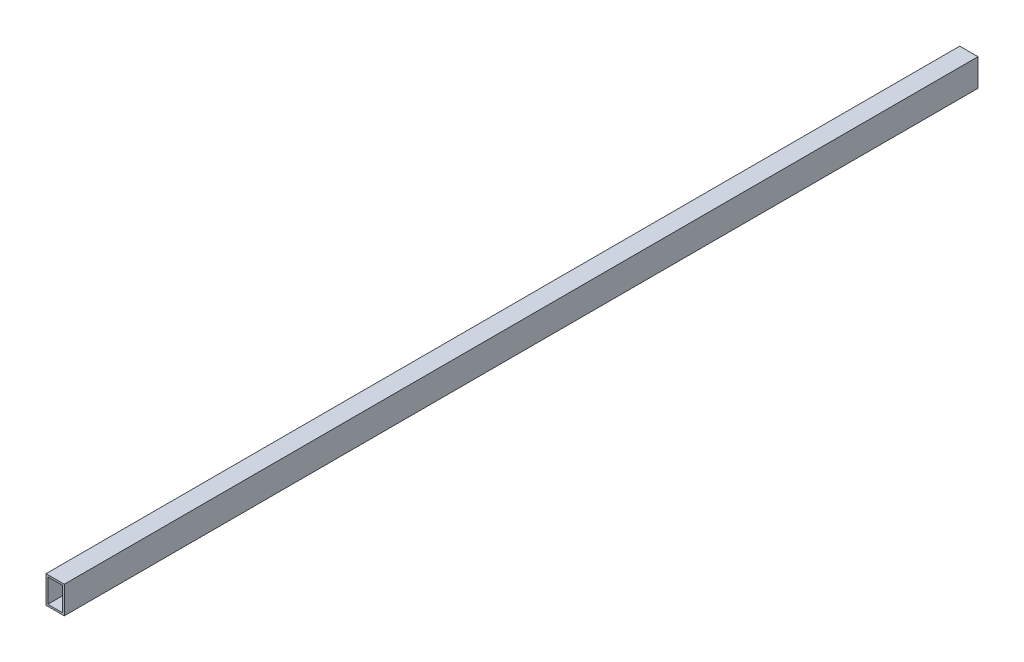
ISO-10303-21;
HEADER;
FILE_DESCRIPTION(('STEP AP214'),'2;1');
FILE_NAME('part.step','',(''),(''),'','','');
FILE_SCHEMA(('AUTOMOTIVE_DESIGN { 1 0 10303 214 1 1 1 1 }'));
ENDSEC;
DATA;
#1=APPLICATION_CONTEXT('core data for automotive mechanical design processes');
#2=APPLICATION_PROTOCOL_DEFINITION('international standard','automotive_design',2000,#1);
#3=PRODUCT_CONTEXT('',#1,'mechanical');
#4=PRODUCT('Part','Part','',(#3));
#5=PRODUCT_RELATED_PRODUCT_CATEGORY('part','',(#4));
#6=PRODUCT_DEFINITION_FORMATION('','',#4);
#7=PRODUCT_DEFINITION_CONTEXT('part definition',#1,'design');
#8=PRODUCT_DEFINITION('design','',#6,#7);
#9=PRODUCT_DEFINITION_SHAPE('','',#8);
#10=(LENGTH_UNIT() NAMED_UNIT(*) SI_UNIT(.MILLI.,.METRE.));
#11=(NAMED_UNIT(*) PLANE_ANGLE_UNIT() SI_UNIT($,.RADIAN.));
#12=(NAMED_UNIT(*) SI_UNIT($,.STERADIAN.) SOLID_ANGLE_UNIT());
#13=UNCERTAINTY_MEASURE_WITH_UNIT(LENGTH_MEASURE(1.E-05),#10,'distance_accuracy_value','');
#14=(GEOMETRIC_REPRESENTATION_CONTEXT(3) GLOBAL_UNCERTAINTY_ASSIGNED_CONTEXT((#13)) GLOBAL_UNIT_ASSIGNED_CONTEXT((#10,
#11,#12)) REPRESENTATION_CONTEXT('',''));
#15=CARTESIAN_POINT('',(0.,0.,0.));
#16=DIRECTION('',(0.,0.,1.));
#17=DIRECTION('',(1.,0.,0.));
#18=AXIS2_PLACEMENT_3D('',#15,#16,#17);
#19=CARTESIAN_POINT('',(0.,0.,1000.));
#20=DIRECTION('',(0.,0.,-1.));
#21=DIRECTION('',(-1.,0.,0.));
#22=AXIS2_PLACEMENT_3D('',#19,#20,#21);
#23=PLANE('',#22);
#24=DIRECTION('',(0.,1.,0.));
#25=VECTOR('',#24,1.);
#26=CARTESIAN_POINT('',(21.5,-15.0000000000001,1000.));
#27=LINE('',#26,#25);
#28=CARTESIAN_POINT('',(21.5,-15.0000000000001,1000.));
#29=VERTEX_POINT('',#28);
#30=CARTESIAN_POINT('',(21.5,14.9999999999999,1000.));
#31=VERTEX_POINT('',#30);
#32=EDGE_CURVE('E166',#29,#31,#27,.T.);
#33=ORIENTED_EDGE('',*,*,#32,.T.);
#34=DIRECTION('',(-1.,0.,0.));
#35=VECTOR('',#34,1.);
#36=CARTESIAN_POINT('',(1.49999999999998,14.9999999999999,1000.));
#37=LINE('',#36,#35);
#38=CARTESIAN_POINT('',(1.49999999999998,14.9999999999999,1000.));
#39=VERTEX_POINT('',#38);
#40=EDGE_CURVE('E170',#31,#39,#37,.T.);
#41=ORIENTED_EDGE('',*,*,#40,.T.);
#42=DIRECTION('',(0.,-1.,0.));
#43=VECTOR('',#42,1.);
#44=CARTESIAN_POINT('',(1.49999999999998,-15.0000000000001,1000.));
#45=LINE('',#44,#43);
#46=CARTESIAN_POINT('',(1.49999999999998,-15.0000000000001,1000.));
#47=VERTEX_POINT('',#46);
#48=EDGE_CURVE('E174',#39,#47,#45,.T.);
#49=ORIENTED_EDGE('',*,*,#48,.T.);
#50=DIRECTION('',(1.,0.,0.));
#51=VECTOR('',#50,1.);
#52=CARTESIAN_POINT('',(1.49999999999998,-15.0000000000001,1000.));
#53=LINE('',#52,#51);
#54=EDGE_CURVE('E177',#47,#29,#53,.T.);
#55=ORIENTED_EDGE('',*,*,#54,.T.);
#56=EDGE_LOOP('',(#33,#41,#49,#55));
#57=FACE_BOUND('',#56,.T.);
#58=DIRECTION('',(0.,-1.,0.));
#59=VECTOR('',#58,1.);
#60=CARTESIAN_POINT('',(3.49999999999998,-13.0000000000001,1000.));
#61=LINE('',#60,#59);
#62=CARTESIAN_POINT('',(3.49999999999998,12.9999999999999,1000.));
#63=VERTEX_POINT('',#62);
#64=CARTESIAN_POINT('',(3.49999999999998,-13.0000000000001,1000.));
#65=VERTEX_POINT('',#64);
#66=EDGE_CURVE('E118',#63,#65,#61,.T.);
#67=ORIENTED_EDGE('',*,*,#66,.F.);
#68=DIRECTION('',(-1.,0.,0.));
#69=VECTOR('',#68,1.);
#70=CARTESIAN_POINT('',(3.49999999999998,12.9999999999999,1000.));
#71=LINE('',#70,#69);
#72=CARTESIAN_POINT('',(19.5,12.9999999999999,1000.));
#73=VERTEX_POINT('',#72);
#74=EDGE_CURVE('E144',#73,#63,#71,.T.);
#75=ORIENTED_EDGE('',*,*,#74,.F.);
#76=DIRECTION('',(0.,1.,0.));
#77=VECTOR('',#76,1.);
#78=CARTESIAN_POINT('',(19.5,-13.0000000000001,1000.));
#79=LINE('',#78,#77);
#80=CARTESIAN_POINT('',(19.5,-13.0000000000001,1000.));
#81=VERTEX_POINT('',#80);
#82=EDGE_CURVE('E140',#81,#73,#79,.T.);
#83=ORIENTED_EDGE('',*,*,#82,.F.);
#84=DIRECTION('',(1.,0.,0.));
#85=VECTOR('',#84,1.);
#86=CARTESIAN_POINT('',(3.49999999999998,-13.0000000000001,1000.));
#87=LINE('',#86,#85);
#88=EDGE_CURVE('E127',#65,#81,#87,.T.);
#89=ORIENTED_EDGE('',*,*,#88,.F.);
#90=EDGE_LOOP('',(#67,#75,#83,#89));
#91=FACE_BOUND('',#90,.T.);
#92=ADVANCED_FACE('F36',(#57,#91),#23,.F.);
#93=CARTESIAN_POINT('',(0.,0.,0.));
#94=DIRECTION('',(0.,0.,-1.));
#95=DIRECTION('',(-1.,0.,0.));
#96=AXIS2_PLACEMENT_3D('',#93,#94,#95);
#97=PLANE('',#96);
#98=DIRECTION('',(0.,1.,0.));
#99=VECTOR('',#98,1.);
#100=CARTESIAN_POINT('',(21.5,-15.0000000000001,0.));
#101=LINE('',#100,#99);
#102=CARTESIAN_POINT('',(21.5,-15.0000000000001,0.));
#103=VERTEX_POINT('',#102);
#104=CARTESIAN_POINT('',(21.5,14.9999999999999,0.));
#105=VERTEX_POINT('',#104);
#106=EDGE_CURVE('E136',#103,#105,#101,.T.);
#107=ORIENTED_EDGE('',*,*,#106,.F.);
#108=DIRECTION('',(1.,0.,0.));
#109=VECTOR('',#108,1.);
#110=CARTESIAN_POINT('',(1.49999999999998,-15.0000000000001,0.));
#111=LINE('',#110,#109);
#112=CARTESIAN_POINT('',(1.49999999999998,-15.0000000000001,0.));
#113=VERTEX_POINT('',#112);
#114=EDGE_CURVE('E171',#113,#103,#111,.T.);
#115=ORIENTED_EDGE('',*,*,#114,.F.);
#116=DIRECTION('',(0.,-1.,0.));
#117=VECTOR('',#116,1.);
#118=CARTESIAN_POINT('',(1.49999999999998,-15.0000000000001,0.));
#119=LINE('',#118,#117);
#120=CARTESIAN_POINT('',(1.49999999999998,14.9999999999999,0.));
#121=VERTEX_POINT('',#120);
#122=EDGE_CURVE('E187',#121,#113,#119,.T.);
#123=ORIENTED_EDGE('',*,*,#122,.F.);
#124=DIRECTION('',(-1.,0.,0.));
#125=VECTOR('',#124,1.);
#126=CARTESIAN_POINT('',(1.49999999999998,14.9999999999999,0.));
#127=LINE('',#126,#125);
#128=EDGE_CURVE('E184',#105,#121,#127,.T.);
#129=ORIENTED_EDGE('',*,*,#128,.F.);
#130=EDGE_LOOP('',(#107,#115,#123,#129));
#131=FACE_BOUND('',#130,.T.);
#132=DIRECTION('',(-1.,0.,0.));
#133=VECTOR('',#132,1.);
#134=CARTESIAN_POINT('',(3.49999999999998,12.9999999999999,0.));
#135=LINE('',#134,#133);
#136=CARTESIAN_POINT('',(19.5,12.9999999999999,0.));
#137=VERTEX_POINT('',#136);
#138=CARTESIAN_POINT('',(3.49999999999998,12.9999999999999,0.));
#139=VERTEX_POINT('',#138);
#140=EDGE_CURVE('E128',#137,#139,#135,.T.);
#141=ORIENTED_EDGE('',*,*,#140,.T.);
#142=DIRECTION('',(0.,-1.,0.));
#143=VECTOR('',#142,1.);
#144=CARTESIAN_POINT('',(3.49999999999998,-13.0000000000001,0.));
#145=LINE('',#144,#143);
#146=CARTESIAN_POINT('',(3.49999999999998,-13.0000000000001,0.));
#147=VERTEX_POINT('',#146);
#148=EDGE_CURVE('E66',#139,#147,#145,.T.);
#149=ORIENTED_EDGE('',*,*,#148,.T.);
#150=DIRECTION('',(1.,0.,0.));
#151=VECTOR('',#150,1.);
#152=CARTESIAN_POINT('',(3.49999999999998,-13.0000000000001,0.));
#153=LINE('',#152,#151);
#154=CARTESIAN_POINT('',(19.5,-13.0000000000001,0.));
#155=VERTEX_POINT('',#154);
#156=EDGE_CURVE('E134',#147,#155,#153,.T.);
#157=ORIENTED_EDGE('',*,*,#156,.T.);
#158=DIRECTION('',(0.,1.,0.));
#159=VECTOR('',#158,1.);
#160=CARTESIAN_POINT('',(19.5,-13.0000000000001,0.));
#161=LINE('',#160,#159);
#162=EDGE_CURVE('E153',#155,#137,#161,.T.);
#163=ORIENTED_EDGE('',*,*,#162,.T.);
#164=EDGE_LOOP('',(#141,#149,#157,#163));
#165=FACE_BOUND('',#164,.T.);
#166=ADVANCED_FACE('F210',(#131,#165),#97,.T.);
#167=CARTESIAN_POINT('',(21.5,-15.0000000000001,1000.));
#168=DIRECTION('',(-1.,0.,0.));
#169=DIRECTION('',(0.,0.,1.));
#170=AXIS2_PLACEMENT_3D('',#167,#168,#169);
#171=PLANE('',#170);
#172=ORIENTED_EDGE('',*,*,#106,.T.);
#173=DIRECTION('',(0.,0.,-1.));
#174=VECTOR('',#173,1.);
#175=CARTESIAN_POINT('',(21.5,14.9999999999999,1000.));
#176=LINE('',#175,#174);
#177=EDGE_CURVE('E11',#31,#105,#176,.T.);
#178=ORIENTED_EDGE('',*,*,#177,.F.);
#179=ORIENTED_EDGE('',*,*,#32,.F.);
#180=DIRECTION('',(0.,0.,-1.));
#181=VECTOR('',#180,1.);
#182=CARTESIAN_POINT('',(21.5,-15.0000000000001,1000.));
#183=LINE('',#182,#181);
#184=EDGE_CURVE('E180',#29,#103,#183,.T.);
#185=ORIENTED_EDGE('',*,*,#184,.T.);
#186=EDGE_LOOP('',(#172,#178,#179,#185));
#187=FACE_BOUND('',#186,.T.);
#188=ADVANCED_FACE('F38',(#187),#171,.F.);
#189=CARTESIAN_POINT('',(1.49999999999998,14.9999999999999,1000.));
#190=DIRECTION('',(0.,-1.,0.));
#191=DIRECTION('',(0.,0.,-1.));
#192=AXIS2_PLACEMENT_3D('',#189,#190,#191);
#193=PLANE('',#192);
#194=ORIENTED_EDGE('',*,*,#128,.T.);
#195=DIRECTION('',(0.,0.,-1.));
#196=VECTOR('',#195,1.);
#197=CARTESIAN_POINT('',(1.49999999999998,14.9999999999999,1000.));
#198=LINE('',#197,#196);
#199=EDGE_CURVE('E45',#39,#121,#198,.T.);
#200=ORIENTED_EDGE('',*,*,#199,.F.);
#201=ORIENTED_EDGE('',*,*,#40,.F.);
#202=ORIENTED_EDGE('',*,*,#177,.T.);
#203=EDGE_LOOP('',(#194,#200,#201,#202));
#204=FACE_BOUND('',#203,.T.);
#205=ADVANCED_FACE('F220',(#204),#193,.F.);
#206=CARTESIAN_POINT('',(1.49999999999998,-15.0000000000001,1000.));
#207=DIRECTION('',(1.,0.,0.));
#208=DIRECTION('',(0.,0.,-1.));
#209=AXIS2_PLACEMENT_3D('',#206,#207,#208);
#210=PLANE('',#209);
#211=ORIENTED_EDGE('',*,*,#122,.T.);
#212=DIRECTION('',(0.,0.,-1.));
#213=VECTOR('',#212,1.);
#214=CARTESIAN_POINT('',(1.49999999999998,-15.0000000000001,1000.));
#215=LINE('',#214,#213);
#216=EDGE_CURVE('E195',#47,#113,#215,.T.);
#217=ORIENTED_EDGE('',*,*,#216,.F.);
#218=ORIENTED_EDGE('',*,*,#48,.F.);
#219=ORIENTED_EDGE('',*,*,#199,.T.);
#220=EDGE_LOOP('',(#211,#217,#218,#219));
#221=FACE_BOUND('',#220,.T.);
#222=ADVANCED_FACE('F204',(#221),#210,.F.);
#223=CARTESIAN_POINT('',(1.49999999999998,-15.0000000000001,1000.));
#224=DIRECTION('',(0.,1.,0.));
#225=DIRECTION('',(0.,0.,1.));
#226=AXIS2_PLACEMENT_3D('',#223,#224,#225);
#227=PLANE('',#226);
#228=ORIENTED_EDGE('',*,*,#114,.T.);
#229=ORIENTED_EDGE('',*,*,#184,.F.);
#230=ORIENTED_EDGE('',*,*,#54,.F.);
#231=ORIENTED_EDGE('',*,*,#216,.T.);
#232=EDGE_LOOP('',(#228,#229,#230,#231));
#233=FACE_BOUND('',#232,.T.);
#234=ADVANCED_FACE('F214',(#233),#227,.F.);
#235=CARTESIAN_POINT('',(3.49999999999998,-13.0000000000001,1000.));
#236=DIRECTION('',(1.,0.,0.));
#237=DIRECTION('',(0.,0.,-1.));
#238=AXIS2_PLACEMENT_3D('',#235,#236,#237);
#239=PLANE('',#238);
#240=ORIENTED_EDGE('',*,*,#148,.F.);
#241=DIRECTION('',(0.,0.,-1.));
#242=VECTOR('',#241,1.);
#243=CARTESIAN_POINT('',(3.49999999999998,12.9999999999999,1000.));
#244=LINE('',#243,#242);
#245=EDGE_CURVE('E122',#63,#139,#244,.T.);
#246=ORIENTED_EDGE('',*,*,#245,.F.);
#247=ORIENTED_EDGE('',*,*,#66,.T.);
#248=DIRECTION('',(0.,0.,-1.));
#249=VECTOR('',#248,1.);
#250=CARTESIAN_POINT('',(3.49999999999998,-13.0000000000001,1000.));
#251=LINE('',#250,#249);
#252=EDGE_CURVE('E121',#65,#147,#251,.T.);
#253=ORIENTED_EDGE('',*,*,#252,.T.);
#254=EDGE_LOOP('',(#240,#246,#247,#253));
#255=FACE_BOUND('',#254,.T.);
#256=ADVANCED_FACE('F120',(#255),#239,.T.);
#257=CARTESIAN_POINT('',(3.49999999999998,-13.0000000000001,1000.));
#258=DIRECTION('',(0.,1.,0.));
#259=DIRECTION('',(0.,0.,1.));
#260=AXIS2_PLACEMENT_3D('',#257,#258,#259);
#261=PLANE('',#260);
#262=ORIENTED_EDGE('',*,*,#156,.F.);
#263=ORIENTED_EDGE('',*,*,#252,.F.);
#264=ORIENTED_EDGE('',*,*,#88,.T.);
#265=DIRECTION('',(0.,0.,-1.));
#266=VECTOR('',#265,1.);
#267=CARTESIAN_POINT('',(19.5,-13.0000000000001,1000.));
#268=LINE('',#267,#266);
#269=EDGE_CURVE('E137',#81,#155,#268,.T.);
#270=ORIENTED_EDGE('',*,*,#269,.T.);
#271=EDGE_LOOP('',(#262,#263,#264,#270));
#272=FACE_BOUND('',#271,.T.);
#273=ADVANCED_FACE('F131',(#272),#261,.T.);
#274=CARTESIAN_POINT('',(19.5,-13.0000000000001,1000.));
#275=DIRECTION('',(-1.,0.,0.));
#276=DIRECTION('',(0.,0.,1.));
#277=AXIS2_PLACEMENT_3D('',#274,#275,#276);
#278=PLANE('',#277);
#279=ORIENTED_EDGE('',*,*,#162,.F.);
#280=ORIENTED_EDGE('',*,*,#269,.F.);
#281=ORIENTED_EDGE('',*,*,#82,.T.);
#282=DIRECTION('',(0.,0.,-1.));
#283=VECTOR('',#282,1.);
#284=CARTESIAN_POINT('',(19.5,12.9999999999999,1000.));
#285=LINE('',#284,#283);
#286=EDGE_CURVE('E55',#73,#137,#285,.T.);
#287=ORIENTED_EDGE('',*,*,#286,.T.);
#288=EDGE_LOOP('',(#279,#280,#281,#287));
#289=FACE_BOUND('',#288,.T.);
#290=ADVANCED_FACE('F243',(#289),#278,.T.);
#291=CARTESIAN_POINT('',(3.49999999999998,12.9999999999999,1000.));
#292=DIRECTION('',(0.,-1.,0.));
#293=DIRECTION('',(0.,0.,-1.));
#294=AXIS2_PLACEMENT_3D('',#291,#292,#293);
#295=PLANE('',#294);
#296=ORIENTED_EDGE('',*,*,#140,.F.);
#297=ORIENTED_EDGE('',*,*,#286,.F.);
#298=ORIENTED_EDGE('',*,*,#74,.T.);
#299=ORIENTED_EDGE('',*,*,#245,.T.);
#300=EDGE_LOOP('',(#296,#297,#298,#299));
#301=FACE_BOUND('',#300,.T.);
#302=ADVANCED_FACE('F247',(#301),#295,.T.);
#303=CLOSED_SHELL('',(#92,#166,#188,#205,#222,#234,#256,#273,#290,#302));
#304=MANIFOLD_SOLID_BREP('B2',#303);
#305=ADVANCED_BREP_SHAPE_REPRESENTATION('',(#18,#304),#14);
#306=SHAPE_DEFINITION_REPRESENTATION(#9,#305);
ENDSEC;
END-ISO-10303-21;
